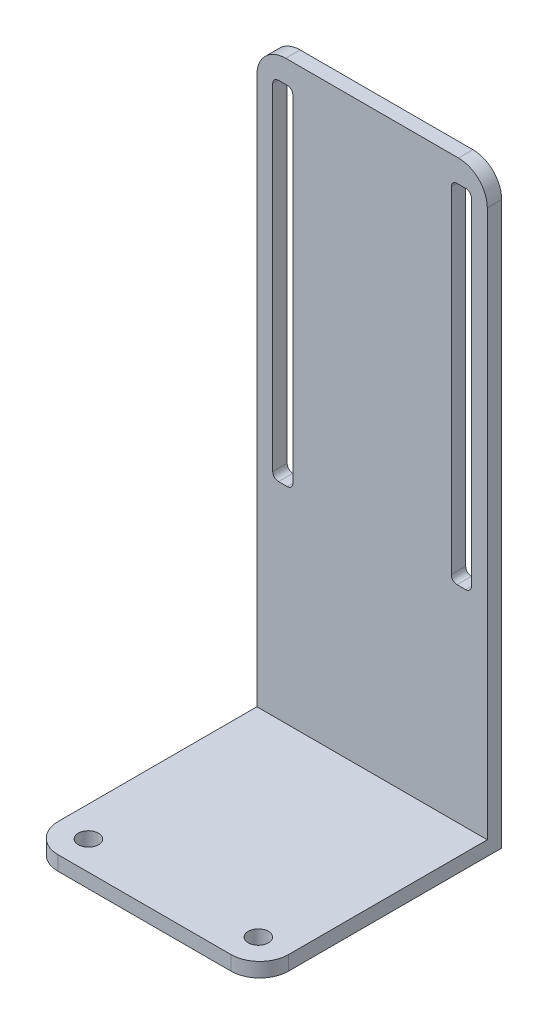
ISO-10303-21;
HEADER;
FILE_DESCRIPTION(('STEP AP214'),'2;1');
FILE_NAME('part.step','',(''),(''),'','','');
FILE_SCHEMA(('AUTOMOTIVE_DESIGN { 1 0 10303 214 1 1 1 1 }'));
ENDSEC;
DATA;
#1=APPLICATION_CONTEXT('core data for automotive mechanical design processes');
#2=APPLICATION_PROTOCOL_DEFINITION('international standard','automotive_design',2000,#1);
#3=PRODUCT_CONTEXT('',#1,'mechanical');
#4=PRODUCT('Part','Part','',(#3));
#5=PRODUCT_RELATED_PRODUCT_CATEGORY('part','',(#4));
#6=PRODUCT_DEFINITION_FORMATION('','',#4);
#7=PRODUCT_DEFINITION_CONTEXT('part definition',#1,'design');
#8=PRODUCT_DEFINITION('design','',#6,#7);
#9=PRODUCT_DEFINITION_SHAPE('','',#8);
#10=(LENGTH_UNIT() NAMED_UNIT(*) SI_UNIT(.MILLI.,.METRE.));
#11=(NAMED_UNIT(*) PLANE_ANGLE_UNIT() SI_UNIT($,.RADIAN.));
#12=(NAMED_UNIT(*) SI_UNIT($,.STERADIAN.) SOLID_ANGLE_UNIT());
#13=UNCERTAINTY_MEASURE_WITH_UNIT(LENGTH_MEASURE(1.E-05),#10,'distance_accuracy_value','');
#14=(GEOMETRIC_REPRESENTATION_CONTEXT(3) GLOBAL_UNCERTAINTY_ASSIGNED_CONTEXT((#13)) GLOBAL_UNIT_ASSIGNED_CONTEXT((#10,
#11,#12)) REPRESENTATION_CONTEXT('',''));
#15=CARTESIAN_POINT('',(0.,0.,0.));
#16=DIRECTION('',(0.,0.,1.));
#17=DIRECTION('',(1.,0.,0.));
#18=AXIS2_PLACEMENT_3D('',#15,#16,#17);
#19=CARTESIAN_POINT('',(-15.,2.5,16.));
#20=DIRECTION('',(0.,-1.,0.));
#21=DIRECTION('',(0.,0.,-1.));
#22=AXIS2_PLACEMENT_3D('',#19,#20,#21);
#23=PLANE('',#22);
#24=CARTESIAN_POINT('',(14.75,2.5,16.));
#25=DIRECTION('',(0.,1.,0.));
#26=DIRECTION('',(0.,0.,1.));
#27=AXIS2_PLACEMENT_3D('',#24,#25,#26);
#28=CIRCLE('',#27,1.75);
#29=CARTESIAN_POINT('',(14.75,2.5,17.75));
#30=VERTEX_POINT('',#29);
#31=EDGE_CURVE('E403',#30,#30,#28,.T.);
#32=ORIENTED_EDGE('',*,*,#31,.F.);
#33=EDGE_LOOP('',(#32));
#34=FACE_BOUND('',#33,.T.);
#35=CARTESIAN_POINT('',(-14.75,2.5,16.));
#36=DIRECTION('',(0.,-1.,0.));
#37=DIRECTION('',(0.,0.,-1.));
#38=AXIS2_PLACEMENT_3D('',#35,#36,#37);
#39=CIRCLE('',#38,1.75000000000001);
#40=CARTESIAN_POINT('',(-14.75,2.5,14.25));
#41=VERTEX_POINT('',#40);
#42=EDGE_CURVE('E409',#41,#41,#39,.T.);
#43=ORIENTED_EDGE('',*,*,#42,.T.);
#44=EDGE_LOOP('',(#43));
#45=FACE_BOUND('',#44,.T.);
#46=DIRECTION('',(1.,0.,0.));
#47=VECTOR('',#46,1.);
#48=CARTESIAN_POINT('',(-20.,2.5,-18.5));
#49=LINE('',#48,#47);
#50=CARTESIAN_POINT('',(-20.,2.5,-18.5));
#51=VERTEX_POINT('',#50);
#52=CARTESIAN_POINT('',(20.,2.5,-18.5));
#53=VERTEX_POINT('',#52);
#54=EDGE_CURVE('E317',#51,#53,#49,.T.);
#55=ORIENTED_EDGE('',*,*,#54,.F.);
#56=DIRECTION('',(0.,0.,1.));
#57=VECTOR('',#56,1.);
#58=CARTESIAN_POINT('',(-20.,2.5,-21.));
#59=LINE('',#58,#57);
#60=CARTESIAN_POINT('',(-20.,2.5,16.));
#61=VERTEX_POINT('',#60);
#62=EDGE_CURVE('E422',#51,#61,#59,.T.);
#63=ORIENTED_EDGE('',*,*,#62,.T.);
#64=CARTESIAN_POINT('',(-15.,2.5,16.));
#65=DIRECTION('',(0.,-1.,0.));
#66=DIRECTION('',(0.,0.,-1.));
#67=AXIS2_PLACEMENT_3D('',#64,#65,#66);
#68=CIRCLE('',#67,5.);
#69=CARTESIAN_POINT('',(-15.,2.5,21.));
#70=VERTEX_POINT('',#69);
#71=EDGE_CURVE('E418',#70,#61,#68,.T.);
#72=ORIENTED_EDGE('',*,*,#71,.F.);
#73=DIRECTION('',(-1.,0.,0.));
#74=VECTOR('',#73,1.);
#75=CARTESIAN_POINT('',(15.,2.5,21.));
#76=LINE('',#75,#74);
#77=CARTESIAN_POINT('',(15.,2.5,21.));
#78=VERTEX_POINT('',#77);
#79=EDGE_CURVE('E415',#78,#70,#76,.T.);
#80=ORIENTED_EDGE('',*,*,#79,.F.);
#81=CARTESIAN_POINT('',(15.,2.5,16.));
#82=DIRECTION('',(0.,-1.,0.));
#83=DIRECTION('',(0.,0.,-1.));
#84=AXIS2_PLACEMENT_3D('',#81,#82,#83);
#85=CIRCLE('',#84,5.);
#86=CARTESIAN_POINT('',(20.,2.5,16.));
#87=VERTEX_POINT('',#86);
#88=EDGE_CURVE('E426',#87,#78,#85,.T.);
#89=ORIENTED_EDGE('',*,*,#88,.F.);
#90=DIRECTION('',(0.,0.,1.));
#91=VECTOR('',#90,1.);
#92=CARTESIAN_POINT('',(20.,2.5,-21.));
#93=LINE('',#92,#91);
#94=EDGE_CURVE('E424',#53,#87,#93,.T.);
#95=ORIENTED_EDGE('',*,*,#94,.F.);
#96=EDGE_LOOP('',(#55,#63,#72,#80,#89,#95));
#97=FACE_BOUND('',#96,.T.);
#98=ADVANCED_FACE('F83',(#34,#45,#97),#23,.F.);
#99=CARTESIAN_POINT('',(-15.,0.,16.));
#100=DIRECTION('',(0.,-1.,0.));
#101=DIRECTION('',(0.,0.,-1.));
#102=AXIS2_PLACEMENT_3D('',#99,#100,#101);
#103=PLANE('',#102);
#104=DIRECTION('',(-1.,0.,0.));
#105=VECTOR('',#104,1.);
#106=CARTESIAN_POINT('',(15.,0.,21.));
#107=LINE('',#106,#105);
#108=CARTESIAN_POINT('',(15.,0.,21.));
#109=VERTEX_POINT('',#108);
#110=CARTESIAN_POINT('',(-15.,0.,21.));
#111=VERTEX_POINT('',#110);
#112=EDGE_CURVE('E412',#109,#111,#107,.T.);
#113=ORIENTED_EDGE('',*,*,#112,.T.);
#114=CARTESIAN_POINT('',(-15.,0.,16.));
#115=DIRECTION('',(0.,-1.,0.));
#116=DIRECTION('',(0.,0.,-1.));
#117=AXIS2_PLACEMENT_3D('',#114,#115,#116);
#118=CIRCLE('',#117,5.);
#119=CARTESIAN_POINT('',(-20.,0.,16.));
#120=VERTEX_POINT('',#119);
#121=EDGE_CURVE('E432',#111,#120,#118,.T.);
#122=ORIENTED_EDGE('',*,*,#121,.T.);
#123=DIRECTION('',(0.,0.,1.));
#124=VECTOR('',#123,1.);
#125=CARTESIAN_POINT('',(-20.,0.,-21.));
#126=LINE('',#125,#124);
#127=CARTESIAN_POINT('',(-20.,0.,-21.));
#128=VERTEX_POINT('',#127);
#129=EDGE_CURVE('E435',#128,#120,#126,.T.);
#130=ORIENTED_EDGE('',*,*,#129,.F.);
#131=DIRECTION('',(-1.,0.,0.));
#132=VECTOR('',#131,1.);
#133=CARTESIAN_POINT('',(20.,0.,-21.));
#134=LINE('',#133,#132);
#135=CARTESIAN_POINT('',(20.,0.,-21.));
#136=VERTEX_POINT('',#135);
#137=EDGE_CURVE('E438',#136,#128,#134,.T.);
#138=ORIENTED_EDGE('',*,*,#137,.F.);
#139=DIRECTION('',(0.,0.,1.));
#140=VECTOR('',#139,1.);
#141=CARTESIAN_POINT('',(20.,0.,-21.));
#142=LINE('',#141,#140);
#143=CARTESIAN_POINT('',(20.,0.,16.));
#144=VERTEX_POINT('',#143);
#145=EDGE_CURVE('E441',#136,#144,#142,.T.);
#146=ORIENTED_EDGE('',*,*,#145,.T.);
#147=CARTESIAN_POINT('',(15.,0.,16.));
#148=DIRECTION('',(0.,-1.,0.));
#149=DIRECTION('',(0.,0.,-1.));
#150=AXIS2_PLACEMENT_3D('',#147,#148,#149);
#151=CIRCLE('',#150,5.);
#152=EDGE_CURVE('E419',#144,#109,#151,.T.);
#153=ORIENTED_EDGE('',*,*,#152,.T.);
#154=EDGE_LOOP('',(#113,#122,#130,#138,#146,#153));
#155=FACE_BOUND('',#154,.T.);
#156=CARTESIAN_POINT('',(-14.75,0.,16.));
#157=DIRECTION('',(0.,-1.,0.));
#158=DIRECTION('',(0.,0.,-1.));
#159=AXIS2_PLACEMENT_3D('',#156,#157,#158);
#160=CIRCLE('',#159,1.75000000000001);
#161=CARTESIAN_POINT('',(-14.75,0.,14.25));
#162=VERTEX_POINT('',#161);
#163=EDGE_CURVE('E406',#162,#162,#160,.T.);
#164=ORIENTED_EDGE('',*,*,#163,.F.);
#165=EDGE_LOOP('',(#164));
#166=FACE_BOUND('',#165,.T.);
#167=CARTESIAN_POINT('',(14.75,0.,16.));
#168=DIRECTION('',(0.,1.,0.));
#169=DIRECTION('',(0.,0.,1.));
#170=AXIS2_PLACEMENT_3D('',#167,#168,#169);
#171=CIRCLE('',#170,1.75);
#172=CARTESIAN_POINT('',(14.75,0.,17.75));
#173=VERTEX_POINT('',#172);
#174=EDGE_CURVE('E402',#173,#173,#171,.T.);
#175=ORIENTED_EDGE('',*,*,#174,.T.);
#176=EDGE_LOOP('',(#175));
#177=FACE_BOUND('',#176,.T.);
#178=ADVANCED_FACE('F492',(#155,#166,#177),#103,.T.);
#179=CARTESIAN_POINT('',(15.,2.5,21.));
#180=DIRECTION('',(0.,0.,1.));
#181=DIRECTION('',(1.,0.,0.));
#182=AXIS2_PLACEMENT_3D('',#179,#180,#181);
#183=PLANE('',#182);
#184=ORIENTED_EDGE('',*,*,#112,.F.);
#185=DIRECTION('',(0.,-1.,0.));
#186=VECTOR('',#185,1.);
#187=CARTESIAN_POINT('',(15.,2.5,21.));
#188=LINE('',#187,#186);
#189=EDGE_CURVE('E446',#78,#109,#188,.T.);
#190=ORIENTED_EDGE('',*,*,#189,.F.);
#191=ORIENTED_EDGE('',*,*,#79,.T.);
#192=DIRECTION('',(0.,-1.,0.));
#193=VECTOR('',#192,1.);
#194=CARTESIAN_POINT('',(-15.,2.5,21.));
#195=LINE('',#194,#193);
#196=EDGE_CURVE('E429',#70,#111,#195,.T.);
#197=ORIENTED_EDGE('',*,*,#196,.T.);
#198=EDGE_LOOP('',(#184,#190,#191,#197));
#199=FACE_BOUND('',#198,.T.);
#200=ADVANCED_FACE('F501',(#199),#183,.T.);
#201=CARTESIAN_POINT('',(15.,2.5,16.));
#202=DIRECTION('',(0.,-1.,0.));
#203=DIRECTION('',(0.,0.,-1.));
#204=AXIS2_PLACEMENT_3D('',#201,#202,#203);
#205=CYLINDRICAL_SURFACE('',#204,5.);
#206=ORIENTED_EDGE('',*,*,#152,.F.);
#207=DIRECTION('',(0.,-1.,0.));
#208=VECTOR('',#207,1.);
#209=CARTESIAN_POINT('',(20.,2.5,16.));
#210=LINE('',#209,#208);
#211=EDGE_CURVE('E449',#87,#144,#210,.T.);
#212=ORIENTED_EDGE('',*,*,#211,.F.);
#213=ORIENTED_EDGE('',*,*,#88,.T.);
#214=ORIENTED_EDGE('',*,*,#189,.T.);
#215=EDGE_LOOP('',(#206,#212,#213,#214));
#216=FACE_BOUND('',#215,.T.);
#217=ADVANCED_FACE('F496',(#216),#205,.T.);
#218=CARTESIAN_POINT('',(20.,2.5,-21.));
#219=DIRECTION('',(1.,0.,0.));
#220=DIRECTION('',(0.,0.,-1.));
#221=AXIS2_PLACEMENT_3D('',#218,#219,#220);
#222=PLANE('',#221);
#223=DIRECTION('',(0.,-1.,0.));
#224=VECTOR('',#223,1.);
#225=CARTESIAN_POINT('',(20.,2.5,-21.));
#226=LINE('',#225,#224);
#227=CARTESIAN_POINT('',(20.,97.5,-21.));
#228=VERTEX_POINT('',#227);
#229=EDGE_CURVE('E451',#228,#136,#226,.T.);
#230=ORIENTED_EDGE('',*,*,#229,.F.);
#231=DIRECTION('',(0.,0.,-1.));
#232=VECTOR('',#231,1.);
#233=CARTESIAN_POINT('',(20.,97.5,-21.));
#234=LINE('',#233,#232);
#235=CARTESIAN_POINT('',(20.,97.5,-18.5));
#236=VERTEX_POINT('',#235);
#237=EDGE_CURVE('E467',#228,#236,#234,.F.);
#238=ORIENTED_EDGE('',*,*,#237,.T.);
#239=DIRECTION('',(0.,-1.,0.));
#240=VECTOR('',#239,1.);
#241=CARTESIAN_POINT('',(20.,102.5,-18.5));
#242=LINE('',#241,#240);
#243=EDGE_CURVE('E396',#236,#53,#242,.T.);
#244=ORIENTED_EDGE('',*,*,#243,.T.);
#245=ORIENTED_EDGE('',*,*,#94,.T.);
#246=ORIENTED_EDGE('',*,*,#211,.T.);
#247=ORIENTED_EDGE('',*,*,#145,.F.);
#248=EDGE_LOOP('',(#230,#238,#244,#245,#246,#247));
#249=FACE_BOUND('',#248,.T.);
#250=ADVANCED_FACE('F488',(#249),#222,.T.);
#251=CARTESIAN_POINT('',(20.,2.5,-21.));
#252=DIRECTION('',(0.,0.,1.));
#253=DIRECTION('',(1.,0.,0.));
#254=AXIS2_PLACEMENT_3D('',#251,#252,#253);
#255=PLANE('',#254);
#256=DIRECTION('',(1.,0.,0.));
#257=VECTOR('',#256,1.);
#258=CARTESIAN_POINT('',(14.75,38.235172541365,-21.));
#259=LINE('',#258,#257);
#260=CARTESIAN_POINT('',(14.75,38.235172541365,-21.));
#261=VERTEX_POINT('',#260);
#262=CARTESIAN_POINT('',(16.25,38.235172541365,-21.));
#263=VERTEX_POINT('',#262);
#264=EDGE_CURVE('E267',#261,#263,#259,.T.);
#265=ORIENTED_EDGE('',*,*,#264,.T.);
#266=CARTESIAN_POINT('',(16.25,39.235172541365,-21.));
#267=DIRECTION('',(0.,0.,1.));
#268=DIRECTION('',(-1.,0.,0.));
#269=AXIS2_PLACEMENT_3D('',#266,#267,#268);
#270=CIRCLE('',#269,1.);
#271=CARTESIAN_POINT('',(17.25,39.235172541365,-21.));
#272=VERTEX_POINT('',#271);
#273=EDGE_CURVE('E259',#263,#272,#270,.T.);
#274=ORIENTED_EDGE('',*,*,#273,.T.);
#275=DIRECTION('',(0.,1.,0.));
#276=VECTOR('',#275,1.);
#277=CARTESIAN_POINT('',(17.25,92.6329456028855,-21.));
#278=LINE('',#277,#276);
#279=CARTESIAN_POINT('',(17.25,97.5563576507307,-21.));
#280=VERTEX_POINT('',#279);
#281=EDGE_CURVE('E270',#272,#280,#278,.T.);
#282=ORIENTED_EDGE('',*,*,#281,.T.);
#283=CARTESIAN_POINT('',(16.25,97.5563576507307,-21.));
#284=DIRECTION('',(0.,0.,1.));
#285=DIRECTION('',(1.,0.,0.));
#286=AXIS2_PLACEMENT_3D('',#283,#284,#285);
#287=CIRCLE('',#286,1.);
#288=CARTESIAN_POINT('',(16.25,98.5563576507307,-21.));
#289=VERTEX_POINT('',#288);
#290=EDGE_CURVE('E98',#280,#289,#287,.T.);
#291=ORIENTED_EDGE('',*,*,#290,.T.);
#292=DIRECTION('',(-1.,0.,0.));
#293=VECTOR('',#292,1.);
#294=CARTESIAN_POINT('',(16.25,98.5563576507307,-21.));
#295=LINE('',#294,#293);
#296=CARTESIAN_POINT('',(14.75,98.5563576507307,-21.));
#297=VERTEX_POINT('',#296);
#298=EDGE_CURVE('E285',#289,#297,#295,.T.);
#299=ORIENTED_EDGE('',*,*,#298,.T.);
#300=CARTESIAN_POINT('',(14.75,97.5563576507307,-21.));
#301=DIRECTION('',(0.,0.,1.));
#302=DIRECTION('',(1.,0.,0.));
#303=AXIS2_PLACEMENT_3D('',#300,#301,#302);
#304=CIRCLE('',#303,1.);
#305=CARTESIAN_POINT('',(13.75,97.5563576507307,-21.));
#306=VERTEX_POINT('',#305);
#307=EDGE_CURVE('E288',#297,#306,#304,.T.);
#308=ORIENTED_EDGE('',*,*,#307,.T.);
#309=DIRECTION('',(0.,-1.,0.));
#310=VECTOR('',#309,1.);
#311=CARTESIAN_POINT('',(13.75,97.5563576507307,-21.));
#312=LINE('',#311,#310);
#313=CARTESIAN_POINT('',(13.75,39.235172541365,-21.));
#314=VERTEX_POINT('',#313);
#315=EDGE_CURVE('E291',#306,#314,#312,.T.);
#316=ORIENTED_EDGE('',*,*,#315,.T.);
#317=CARTESIAN_POINT('',(14.75,39.235172541365,-21.));
#318=DIRECTION('',(0.,0.,1.));
#319=DIRECTION('',(1.,0.,0.));
#320=AXIS2_PLACEMENT_3D('',#317,#318,#319);
#321=CIRCLE('',#320,1.);
#322=EDGE_CURVE('E294',#314,#261,#321,.T.);
#323=ORIENTED_EDGE('',*,*,#322,.T.);
#324=EDGE_LOOP('',(#265,#274,#282,#291,#299,#308,#316,#323));
#325=FACE_BOUND('',#324,.T.);
#326=CARTESIAN_POINT('',(-16.25,97.5563576507307,-21.));
#327=DIRECTION('',(0.,0.,1.));
#328=DIRECTION('',(-1.,0.,0.));
#329=AXIS2_PLACEMENT_3D('',#326,#327,#328);
#330=CIRCLE('',#329,1.);
#331=CARTESIAN_POINT('',(-16.25,98.5563576507307,-21.));
#332=VERTEX_POINT('',#331);
#333=CARTESIAN_POINT('',(-17.25,97.5563576507307,-21.));
#334=VERTEX_POINT('',#333);
#335=EDGE_CURVE('E331',#332,#334,#330,.T.);
#336=ORIENTED_EDGE('',*,*,#335,.T.);
#337=DIRECTION('',(0.,-1.,0.));
#338=VECTOR('',#337,1.);
#339=CARTESIAN_POINT('',(-17.25,92.6329456028855,-21.));
#340=LINE('',#339,#338);
#341=CARTESIAN_POINT('',(-17.25,39.235172541365,-21.));
#342=VERTEX_POINT('',#341);
#343=EDGE_CURVE('E350',#334,#342,#340,.T.);
#344=ORIENTED_EDGE('',*,*,#343,.T.);
#345=CARTESIAN_POINT('',(-16.25,39.235172541365,-21.));
#346=DIRECTION('',(0.,0.,1.));
#347=DIRECTION('',(1.,0.,0.));
#348=AXIS2_PLACEMENT_3D('',#345,#346,#347);
#349=CIRCLE('',#348,1.);
#350=CARTESIAN_POINT('',(-16.25,38.235172541365,-21.));
#351=VERTEX_POINT('',#350);
#352=EDGE_CURVE('E385',#342,#351,#349,.T.);
#353=ORIENTED_EDGE('',*,*,#352,.T.);
#354=DIRECTION('',(1.,0.,0.));
#355=VECTOR('',#354,1.);
#356=CARTESIAN_POINT('',(-14.75,38.235172541365,-21.));
#357=LINE('',#356,#355);
#358=CARTESIAN_POINT('',(-14.75,38.235172541365,-21.));
#359=VERTEX_POINT('',#358);
#360=EDGE_CURVE('E106',#351,#359,#357,.T.);
#361=ORIENTED_EDGE('',*,*,#360,.T.);
#362=CARTESIAN_POINT('',(-14.75,39.235172541365,-21.));
#363=DIRECTION('',(0.,0.,1.));
#364=DIRECTION('',(-1.,0.,0.));
#365=AXIS2_PLACEMENT_3D('',#362,#363,#364);
#366=CIRCLE('',#365,1.);
#367=CARTESIAN_POINT('',(-13.75,39.235172541365,-21.));
#368=VERTEX_POINT('',#367);
#369=EDGE_CURVE('E381',#359,#368,#366,.T.);
#370=ORIENTED_EDGE('',*,*,#369,.T.);
#371=DIRECTION('',(0.,1.,0.));
#372=VECTOR('',#371,1.);
#373=CARTESIAN_POINT('',(-13.75,97.5563576507307,-21.));
#374=LINE('',#373,#372);
#375=CARTESIAN_POINT('',(-13.75,97.5563576507307,-21.));
#376=VERTEX_POINT('',#375);
#377=EDGE_CURVE('E378',#368,#376,#374,.T.);
#378=ORIENTED_EDGE('',*,*,#377,.T.);
#379=CARTESIAN_POINT('',(-14.75,97.5563576507307,-21.));
#380=DIRECTION('',(0.,0.,1.));
#381=DIRECTION('',(-1.,0.,0.));
#382=AXIS2_PLACEMENT_3D('',#379,#380,#381);
#383=CIRCLE('',#382,1.);
#384=CARTESIAN_POINT('',(-14.75,98.5563576507307,-21.));
#385=VERTEX_POINT('',#384);
#386=EDGE_CURVE('E375',#376,#385,#383,.T.);
#387=ORIENTED_EDGE('',*,*,#386,.T.);
#388=DIRECTION('',(-1.,0.,0.));
#389=VECTOR('',#388,1.);
#390=CARTESIAN_POINT('',(-16.25,98.5563576507307,-21.));
#391=LINE('',#390,#389);
#392=EDGE_CURVE('E372',#385,#332,#391,.T.);
#393=ORIENTED_EDGE('',*,*,#392,.T.);
#394=EDGE_LOOP('',(#336,#344,#353,#361,#370,#378,#387,#393));
#395=FACE_BOUND('',#394,.T.);
#396=DIRECTION('',(-1.,0.,0.));
#397=VECTOR('',#396,1.);
#398=CARTESIAN_POINT('',(20.,102.5,-21.));
#399=LINE('',#398,#397);
#400=CARTESIAN_POINT('',(15.,102.5,-21.));
#401=VERTEX_POINT('',#400);
#402=CARTESIAN_POINT('',(-15.,102.5,-21.));
#403=VERTEX_POINT('',#402);
#404=EDGE_CURVE('E390',#401,#403,#399,.T.);
#405=ORIENTED_EDGE('',*,*,#404,.F.);
#406=CARTESIAN_POINT('',(15.,97.5,-21.));
#407=DIRECTION('',(0.,0.,1.));
#408=DIRECTION('',(1.,0.,0.));
#409=AXIS2_PLACEMENT_3D('',#406,#407,#408);
#410=CIRCLE('',#409,5.);
#411=EDGE_CURVE('E465',#401,#228,#410,.F.);
#412=ORIENTED_EDGE('',*,*,#411,.T.);
#413=ORIENTED_EDGE('',*,*,#229,.T.);
#414=ORIENTED_EDGE('',*,*,#137,.T.);
#415=DIRECTION('',(0.,-1.,0.));
#416=VECTOR('',#415,1.);
#417=CARTESIAN_POINT('',(-20.,2.5,-21.));
#418=LINE('',#417,#416);
#419=CARTESIAN_POINT('',(-20.,97.5,-21.));
#420=VERTEX_POINT('',#419);
#421=EDGE_CURVE('E453',#420,#128,#418,.T.);
#422=ORIENTED_EDGE('',*,*,#421,.F.);
#423=CARTESIAN_POINT('',(-15.,97.5,-21.));
#424=DIRECTION('',(0.,0.,1.));
#425=DIRECTION('',(1.,0.,0.));
#426=AXIS2_PLACEMENT_3D('',#423,#424,#425);
#427=CIRCLE('',#426,5.);
#428=EDGE_CURVE('E463',#420,#403,#427,.F.);
#429=ORIENTED_EDGE('',*,*,#428,.T.);
#430=EDGE_LOOP('',(#405,#412,#413,#414,#422,#429));
#431=FACE_BOUND('',#430,.T.);
#432=ADVANCED_FACE('F274',(#325,#395,#431),#255,.F.);
#433=CARTESIAN_POINT('',(-20.,2.5,-21.));
#434=DIRECTION('',(1.,0.,0.));
#435=DIRECTION('',(0.,0.,-1.));
#436=AXIS2_PLACEMENT_3D('',#433,#434,#435);
#437=PLANE('',#436);
#438=DIRECTION('',(0.,-1.,0.));
#439=VECTOR('',#438,1.);
#440=CARTESIAN_POINT('',(-20.,102.5,-18.5));
#441=LINE('',#440,#439);
#442=CARTESIAN_POINT('',(-20.,97.5,-18.5));
#443=VERTEX_POINT('',#442);
#444=EDGE_CURVE('E400',#443,#51,#441,.T.);
#445=ORIENTED_EDGE('',*,*,#444,.F.);
#446=DIRECTION('',(0.,0.,1.));
#447=VECTOR('',#446,1.);
#448=CARTESIAN_POINT('',(-20.,97.5,-21.));
#449=LINE('',#448,#447);
#450=EDGE_CURVE('E12',#443,#420,#449,.F.);
#451=ORIENTED_EDGE('',*,*,#450,.T.);
#452=ORIENTED_EDGE('',*,*,#421,.T.);
#453=ORIENTED_EDGE('',*,*,#129,.T.);
#454=DIRECTION('',(0.,-1.,0.));
#455=VECTOR('',#454,1.);
#456=CARTESIAN_POINT('',(-20.,2.5,16.));
#457=LINE('',#456,#455);
#458=EDGE_CURVE('E455',#61,#120,#457,.T.);
#459=ORIENTED_EDGE('',*,*,#458,.F.);
#460=ORIENTED_EDGE('',*,*,#62,.F.);
#461=EDGE_LOOP('',(#445,#451,#452,#453,#459,#460));
#462=FACE_BOUND('',#461,.T.);
#463=ADVANCED_FACE('F510',(#462),#437,.F.);
#464=CARTESIAN_POINT('',(-15.,2.5,16.));
#465=DIRECTION('',(0.,-1.,0.));
#466=DIRECTION('',(0.,0.,-1.));
#467=AXIS2_PLACEMENT_3D('',#464,#465,#466);
#468=CYLINDRICAL_SURFACE('',#467,5.);
#469=ORIENTED_EDGE('',*,*,#121,.F.);
#470=ORIENTED_EDGE('',*,*,#196,.F.);
#471=ORIENTED_EDGE('',*,*,#71,.T.);
#472=ORIENTED_EDGE('',*,*,#458,.T.);
#473=EDGE_LOOP('',(#469,#470,#471,#472));
#474=FACE_BOUND('',#473,.T.);
#475=ADVANCED_FACE('F504',(#474),#468,.T.);
#476=CARTESIAN_POINT('',(-14.75,2.5,16.));
#477=DIRECTION('',(0.,-1.,0.));
#478=DIRECTION('',(0.,0.,-1.));
#479=AXIS2_PLACEMENT_3D('',#476,#477,#478);
#480=CYLINDRICAL_SURFACE('',#479,1.75000000000001);
#481=ORIENTED_EDGE('',*,*,#42,.F.);
#482=EDGE_LOOP('',(#481));
#483=FACE_BOUND('',#482,.T.);
#484=ORIENTED_EDGE('',*,*,#163,.T.);
#485=EDGE_LOOP('',(#484));
#486=FACE_BOUND('',#485,.T.);
#487=ADVANCED_FACE('F530',(#483,#486),#480,.F.);
#488=CARTESIAN_POINT('',(14.75,2.5,16.));
#489=DIRECTION('',(0.,-1.,0.));
#490=DIRECTION('',(0.,0.,-1.));
#491=AXIS2_PLACEMENT_3D('',#488,#489,#490);
#492=CYLINDRICAL_SURFACE('',#491,1.75);
#493=ORIENTED_EDGE('',*,*,#31,.T.);
#494=EDGE_LOOP('',(#493));
#495=FACE_BOUND('',#494,.T.);
#496=ORIENTED_EDGE('',*,*,#174,.F.);
#497=EDGE_LOOP('',(#496));
#498=FACE_BOUND('',#497,.T.);
#499=ADVANCED_FACE('F553',(#495,#498),#492,.F.);
#500=CARTESIAN_POINT('',(-20.,102.5,-18.5));
#501=DIRECTION('',(0.,0.,-1.));
#502=DIRECTION('',(-1.,0.,0.));
#503=AXIS2_PLACEMENT_3D('',#500,#501,#502);
#504=PLANE('',#503);
#505=DIRECTION('',(0.,1.,0.));
#506=VECTOR('',#505,1.);
#507=CARTESIAN_POINT('',(17.25,92.6329456028855,-18.5));
#508=LINE('',#507,#506);
#509=CARTESIAN_POINT('',(17.25,39.235172541365,-18.5));
#510=VERTEX_POINT('',#509);
#511=CARTESIAN_POINT('',(17.25,97.5563576507307,-18.5));
#512=VERTEX_POINT('',#511);
#513=EDGE_CURVE('E298',#510,#512,#508,.T.);
#514=ORIENTED_EDGE('',*,*,#513,.F.);
#515=CARTESIAN_POINT('',(16.25,39.235172541365,-18.5));
#516=DIRECTION('',(0.,0.,1.));
#517=DIRECTION('',(-1.,0.,0.));
#518=AXIS2_PLACEMENT_3D('',#515,#516,#517);
#519=CIRCLE('',#518,1.);
#520=CARTESIAN_POINT('',(16.25,38.235172541365,-18.5));
#521=VERTEX_POINT('',#520);
#522=EDGE_CURVE('E262',#521,#510,#519,.T.);
#523=ORIENTED_EDGE('',*,*,#522,.F.);
#524=DIRECTION('',(1.,0.,0.));
#525=VECTOR('',#524,1.);
#526=CARTESIAN_POINT('',(14.75,38.235172541365,-18.5));
#527=LINE('',#526,#525);
#528=CARTESIAN_POINT('',(14.75,38.235172541365,-18.5));
#529=VERTEX_POINT('',#528);
#530=EDGE_CURVE('E278',#529,#521,#527,.T.);
#531=ORIENTED_EDGE('',*,*,#530,.F.);
#532=CARTESIAN_POINT('',(14.75,39.235172541365,-18.5));
#533=DIRECTION('',(0.,0.,1.));
#534=DIRECTION('',(1.,0.,0.));
#535=AXIS2_PLACEMENT_3D('',#532,#533,#534);
#536=CIRCLE('',#535,1.);
#537=CARTESIAN_POINT('',(13.75,39.235172541365,-18.5));
#538=VERTEX_POINT('',#537);
#539=EDGE_CURVE('E281',#538,#529,#536,.T.);
#540=ORIENTED_EDGE('',*,*,#539,.F.);
#541=DIRECTION('',(0.,-1.,0.));
#542=VECTOR('',#541,1.);
#543=CARTESIAN_POINT('',(13.75,97.5563576507307,-18.5));
#544=LINE('',#543,#542);
#545=CARTESIAN_POINT('',(13.75,97.5563576507307,-18.5));
#546=VERTEX_POINT('',#545);
#547=EDGE_CURVE('E310',#546,#538,#544,.T.);
#548=ORIENTED_EDGE('',*,*,#547,.F.);
#549=CARTESIAN_POINT('',(14.75,97.5563576507307,-18.5));
#550=DIRECTION('',(0.,0.,1.));
#551=DIRECTION('',(1.,0.,0.));
#552=AXIS2_PLACEMENT_3D('',#549,#550,#551);
#553=CIRCLE('',#552,1.);
#554=CARTESIAN_POINT('',(14.75,98.5563576507307,-18.5));
#555=VERTEX_POINT('',#554);
#556=EDGE_CURVE('E307',#555,#546,#553,.T.);
#557=ORIENTED_EDGE('',*,*,#556,.F.);
#558=DIRECTION('',(-1.,0.,0.));
#559=VECTOR('',#558,1.);
#560=CARTESIAN_POINT('',(16.25,98.5563576507307,-18.5));
#561=LINE('',#560,#559);
#562=CARTESIAN_POINT('',(16.25,98.5563576507307,-18.5));
#563=VERTEX_POINT('',#562);
#564=EDGE_CURVE('E304',#563,#555,#561,.T.);
#565=ORIENTED_EDGE('',*,*,#564,.F.);
#566=CARTESIAN_POINT('',(16.25,97.5563576507307,-18.5));
#567=DIRECTION('',(0.,0.,1.));
#568=DIRECTION('',(1.,0.,0.));
#569=AXIS2_PLACEMENT_3D('',#566,#567,#568);
#570=CIRCLE('',#569,1.);
#571=EDGE_CURVE('E301',#512,#563,#570,.T.);
#572=ORIENTED_EDGE('',*,*,#571,.F.);
#573=EDGE_LOOP('',(#514,#523,#531,#540,#548,#557,#565,#572));
#574=FACE_BOUND('',#573,.T.);
#575=CARTESIAN_POINT('',(-16.25,39.235172541365,-18.5));
#576=DIRECTION('',(0.,0.,1.));
#577=DIRECTION('',(1.,0.,0.));
#578=AXIS2_PLACEMENT_3D('',#575,#576,#577);
#579=CIRCLE('',#578,1.);
#580=CARTESIAN_POINT('',(-17.25,39.235172541365,-18.5));
#581=VERTEX_POINT('',#580);
#582=CARTESIAN_POINT('',(-16.25,38.235172541365,-18.5));
#583=VERTEX_POINT('',#582);
#584=EDGE_CURVE('E299',#581,#583,#579,.T.);
#585=ORIENTED_EDGE('',*,*,#584,.F.);
#586=DIRECTION('',(0.,-1.,0.));
#587=VECTOR('',#586,1.);
#588=CARTESIAN_POINT('',(-17.25,92.6329456028855,-18.5));
#589=LINE('',#588,#587);
#590=CARTESIAN_POINT('',(-17.25,97.5563576507307,-18.5));
#591=VERTEX_POINT('',#590);
#592=EDGE_CURVE('E346',#591,#581,#589,.T.);
#593=ORIENTED_EDGE('',*,*,#592,.F.);
#594=CARTESIAN_POINT('',(-16.25,97.5563576507307,-18.5));
#595=DIRECTION('',(0.,0.,1.));
#596=DIRECTION('',(-1.,0.,0.));
#597=AXIS2_PLACEMENT_3D('',#594,#595,#596);
#598=CIRCLE('',#597,1.);
#599=CARTESIAN_POINT('',(-16.25,98.5563576507307,-18.5));
#600=VERTEX_POINT('',#599);
#601=EDGE_CURVE('E349',#600,#591,#598,.T.);
#602=ORIENTED_EDGE('',*,*,#601,.F.);
#603=DIRECTION('',(-1.,0.,0.));
#604=VECTOR('',#603,1.);
#605=CARTESIAN_POINT('',(-16.25,98.5563576507307,-18.5));
#606=LINE('',#605,#604);
#607=CARTESIAN_POINT('',(-14.75,98.5563576507307,-18.5));
#608=VERTEX_POINT('',#607);
#609=EDGE_CURVE('E353',#608,#600,#606,.T.);
#610=ORIENTED_EDGE('',*,*,#609,.F.);
#611=CARTESIAN_POINT('',(-14.75,97.5563576507307,-18.5));
#612=DIRECTION('',(0.,0.,1.));
#613=DIRECTION('',(-1.,0.,0.));
#614=AXIS2_PLACEMENT_3D('',#611,#612,#613);
#615=CIRCLE('',#614,1.);
#616=CARTESIAN_POINT('',(-13.75,97.5563576507307,-18.5));
#617=VERTEX_POINT('',#616);
#618=EDGE_CURVE('E356',#617,#608,#615,.T.);
#619=ORIENTED_EDGE('',*,*,#618,.F.);
#620=DIRECTION('',(0.,1.,0.));
#621=VECTOR('',#620,1.);
#622=CARTESIAN_POINT('',(-13.75,97.5563576507307,-18.5));
#623=LINE('',#622,#621);
#624=CARTESIAN_POINT('',(-13.75,39.235172541365,-18.5));
#625=VERTEX_POINT('',#624);
#626=EDGE_CURVE('E359',#625,#617,#623,.T.);
#627=ORIENTED_EDGE('',*,*,#626,.F.);
#628=CARTESIAN_POINT('',(-14.75,39.235172541365,-18.5));
#629=DIRECTION('',(0.,0.,1.));
#630=DIRECTION('',(-1.,0.,0.));
#631=AXIS2_PLACEMENT_3D('',#628,#629,#630);
#632=CIRCLE('',#631,1.);
#633=CARTESIAN_POINT('',(-14.75,38.235172541365,-18.5));
#634=VERTEX_POINT('',#633);
#635=EDGE_CURVE('E362',#634,#625,#632,.T.);
#636=ORIENTED_EDGE('',*,*,#635,.F.);
#637=DIRECTION('',(1.,0.,0.));
#638=VECTOR('',#637,1.);
#639=CARTESIAN_POINT('',(-14.75,38.235172541365,-18.5));
#640=LINE('',#639,#638);
#641=EDGE_CURVE('E365',#583,#634,#640,.T.);
#642=ORIENTED_EDGE('',*,*,#641,.F.);
#643=EDGE_LOOP('',(#585,#593,#602,#610,#619,#627,#636,#642));
#644=FACE_BOUND('',#643,.T.);
#645=ORIENTED_EDGE('',*,*,#243,.F.);
#646=CARTESIAN_POINT('',(15.,97.5,-18.5));
#647=DIRECTION('',(0.,0.,-1.));
#648=DIRECTION('',(-1.,0.,0.));
#649=AXIS2_PLACEMENT_3D('',#646,#647,#648);
#650=CIRCLE('',#649,5.);
#651=CARTESIAN_POINT('',(15.,102.5,-18.5));
#652=VERTEX_POINT('',#651);
#653=EDGE_CURVE('E91',#236,#652,#650,.F.);
#654=ORIENTED_EDGE('',*,*,#653,.T.);
#655=DIRECTION('',(1.,0.,0.));
#656=VECTOR('',#655,1.);
#657=CARTESIAN_POINT('',(-20.,102.5,-18.5));
#658=LINE('',#657,#656);
#659=CARTESIAN_POINT('',(-15.,102.5,-18.5));
#660=VERTEX_POINT('',#659);
#661=EDGE_CURVE('E393',#660,#652,#658,.T.);
#662=ORIENTED_EDGE('',*,*,#661,.F.);
#663=CARTESIAN_POINT('',(-15.,97.5,-18.5));
#664=DIRECTION('',(0.,0.,-1.));
#665=DIRECTION('',(-1.,0.,0.));
#666=AXIS2_PLACEMENT_3D('',#663,#664,#665);
#667=CIRCLE('',#666,5.);
#668=EDGE_CURVE('E469',#660,#443,#667,.F.);
#669=ORIENTED_EDGE('',*,*,#668,.T.);
#670=ORIENTED_EDGE('',*,*,#444,.T.);
#671=ORIENTED_EDGE('',*,*,#54,.T.);
#672=EDGE_LOOP('',(#645,#654,#662,#669,#670,#671));
#673=FACE_BOUND('',#672,.T.);
#674=ADVANCED_FACE('F474',(#574,#644,#673),#504,.F.);
#675=CARTESIAN_POINT('',(0.,102.5,0.));
#676=DIRECTION('',(0.,1.,0.));
#677=DIRECTION('',(0.,0.,1.));
#678=AXIS2_PLACEMENT_3D('',#675,#676,#677);
#679=PLANE('',#678);
#680=ORIENTED_EDGE('',*,*,#661,.T.);
#681=DIRECTION('',(0.,0.,-1.));
#682=VECTOR('',#681,1.);
#683=CARTESIAN_POINT('',(15.,102.5,0.));
#684=LINE('',#683,#682);
#685=EDGE_CURVE('E460',#652,#401,#684,.T.);
#686=ORIENTED_EDGE('',*,*,#685,.T.);
#687=ORIENTED_EDGE('',*,*,#404,.T.);
#688=DIRECTION('',(0.,0.,1.));
#689=VECTOR('',#688,1.);
#690=CARTESIAN_POINT('',(-15.,102.5,-18.5));
#691=LINE('',#690,#689);
#692=EDGE_CURVE('E448',#403,#660,#691,.T.);
#693=ORIENTED_EDGE('',*,*,#692,.T.);
#694=EDGE_LOOP('',(#680,#686,#687,#693));
#695=FACE_BOUND('',#694,.T.);
#696=ADVANCED_FACE('F479',(#695),#679,.T.);
#697=CARTESIAN_POINT('',(15.,97.5,0.));
#698=DIRECTION('',(0.,0.,-1.));
#699=DIRECTION('',(-1.,0.,0.));
#700=AXIS2_PLACEMENT_3D('',#697,#698,#699);
#701=CYLINDRICAL_SURFACE('',#700,5.);
#702=ORIENTED_EDGE('',*,*,#653,.F.);
#703=ORIENTED_EDGE('',*,*,#237,.F.);
#704=ORIENTED_EDGE('',*,*,#411,.F.);
#705=ORIENTED_EDGE('',*,*,#685,.F.);
#706=EDGE_LOOP('',(#702,#703,#704,#705));
#707=FACE_BOUND('',#706,.T.);
#708=ADVANCED_FACE('F482',(#707),#701,.T.);
#709=CARTESIAN_POINT('',(-15.,97.5,0.));
#710=DIRECTION('',(0.,0.,-1.));
#711=DIRECTION('',(-1.,0.,0.));
#712=AXIS2_PLACEMENT_3D('',#709,#710,#711);
#713=CYLINDRICAL_SURFACE('',#712,5.);
#714=ORIENTED_EDGE('',*,*,#428,.F.);
#715=ORIENTED_EDGE('',*,*,#450,.F.);
#716=ORIENTED_EDGE('',*,*,#668,.F.);
#717=ORIENTED_EDGE('',*,*,#692,.F.);
#718=EDGE_LOOP('',(#714,#715,#716,#717));
#719=FACE_BOUND('',#718,.T.);
#720=ADVANCED_FACE('F85',(#719),#713,.T.);
#721=CARTESIAN_POINT('',(-17.25,92.6329456028855,-21.));
#722=DIRECTION('',(-1.,0.,0.));
#723=DIRECTION('',(0.,0.,1.));
#724=AXIS2_PLACEMENT_3D('',#721,#722,#723);
#725=PLANE('',#724);
#726=ORIENTED_EDGE('',*,*,#592,.T.);
#727=DIRECTION('',(0.,0.,1.));
#728=VECTOR('',#727,1.);
#729=CARTESIAN_POINT('',(-17.25,39.235172541365,-21.));
#730=LINE('',#729,#728);
#731=EDGE_CURVE('E329',#342,#581,#730,.T.);
#732=ORIENTED_EDGE('',*,*,#731,.F.);
#733=ORIENTED_EDGE('',*,*,#343,.F.);
#734=DIRECTION('',(0.,0.,1.));
#735=VECTOR('',#734,1.);
#736=CARTESIAN_POINT('',(-17.25,97.5563576507307,-21.));
#737=LINE('',#736,#735);
#738=EDGE_CURVE('E344',#334,#591,#737,.T.);
#739=ORIENTED_EDGE('',*,*,#738,.T.);
#740=EDGE_LOOP('',(#726,#732,#733,#739));
#741=FACE_BOUND('',#740,.T.);
#742=ADVANCED_FACE('F548',(#741),#725,.F.);
#743=CARTESIAN_POINT('',(-16.25,97.5563576507307,-21.));
#744=DIRECTION('',(0.,0.,1.));
#745=DIRECTION('',(1.,0.,0.));
#746=AXIS2_PLACEMENT_3D('',#743,#744,#745);
#747=CYLINDRICAL_SURFACE('',#746,1.);
#748=ORIENTED_EDGE('',*,*,#601,.T.);
#749=ORIENTED_EDGE('',*,*,#738,.F.);
#750=ORIENTED_EDGE('',*,*,#335,.F.);
#751=DIRECTION('',(0.,0.,1.));
#752=VECTOR('',#751,1.);
#753=CARTESIAN_POINT('',(-16.25,98.5563576507307,-21.));
#754=LINE('',#753,#752);
#755=EDGE_CURVE('E342',#332,#600,#754,.T.);
#756=ORIENTED_EDGE('',*,*,#755,.T.);
#757=EDGE_LOOP('',(#748,#749,#750,#756));
#758=FACE_BOUND('',#757,.T.);
#759=ADVANCED_FACE('F648',(#758),#747,.F.);
#760=CARTESIAN_POINT('',(-16.25,98.5563576507307,-21.));
#761=DIRECTION('',(0.,1.,0.));
#762=DIRECTION('',(0.,0.,1.));
#763=AXIS2_PLACEMENT_3D('',#760,#761,#762);
#764=PLANE('',#763);
#765=ORIENTED_EDGE('',*,*,#609,.T.);
#766=ORIENTED_EDGE('',*,*,#755,.F.);
#767=ORIENTED_EDGE('',*,*,#392,.F.);
#768=DIRECTION('',(0.,0.,1.));
#769=VECTOR('',#768,1.);
#770=CARTESIAN_POINT('',(-14.75,98.5563576507307,-21.));
#771=LINE('',#770,#769);
#772=EDGE_CURVE('E340',#385,#608,#771,.T.);
#773=ORIENTED_EDGE('',*,*,#772,.T.);
#774=EDGE_LOOP('',(#765,#766,#767,#773));
#775=FACE_BOUND('',#774,.T.);
#776=ADVANCED_FACE('F657',(#775),#764,.F.);
#777=CARTESIAN_POINT('',(-14.75,97.5563576507307,-21.));
#778=DIRECTION('',(0.,0.,1.));
#779=DIRECTION('',(1.,0.,0.));
#780=AXIS2_PLACEMENT_3D('',#777,#778,#779);
#781=CYLINDRICAL_SURFACE('',#780,1.);
#782=ORIENTED_EDGE('',*,*,#618,.T.);
#783=ORIENTED_EDGE('',*,*,#772,.F.);
#784=ORIENTED_EDGE('',*,*,#386,.F.);
#785=DIRECTION('',(0.,0.,1.));
#786=VECTOR('',#785,1.);
#787=CARTESIAN_POINT('',(-13.75,97.5563576507307,-21.));
#788=LINE('',#787,#786);
#789=EDGE_CURVE('E338',#376,#617,#788,.T.);
#790=ORIENTED_EDGE('',*,*,#789,.T.);
#791=EDGE_LOOP('',(#782,#783,#784,#790));
#792=FACE_BOUND('',#791,.T.);
#793=ADVANCED_FACE('F665',(#792),#781,.F.);
#794=CARTESIAN_POINT('',(-13.75,97.5563576507307,-21.));
#795=DIRECTION('',(1.,0.,0.));
#796=DIRECTION('',(0.,1.,0.));
#797=AXIS2_PLACEMENT_3D('',#794,#795,#796);
#798=PLANE('',#797);
#799=ORIENTED_EDGE('',*,*,#626,.T.);
#800=ORIENTED_EDGE('',*,*,#789,.F.);
#801=ORIENTED_EDGE('',*,*,#377,.F.);
#802=DIRECTION('',(0.,0.,1.));
#803=VECTOR('',#802,1.);
#804=CARTESIAN_POINT('',(-13.75,39.235172541365,-21.));
#805=LINE('',#804,#803);
#806=EDGE_CURVE('E336',#368,#625,#805,.T.);
#807=ORIENTED_EDGE('',*,*,#806,.T.);
#808=EDGE_LOOP('',(#799,#800,#801,#807));
#809=FACE_BOUND('',#808,.T.);
#810=ADVANCED_FACE('F674',(#809),#798,.F.);
#811=CARTESIAN_POINT('',(-14.75,39.235172541365,-21.));
#812=DIRECTION('',(0.,0.,1.));
#813=DIRECTION('',(1.,0.,0.));
#814=AXIS2_PLACEMENT_3D('',#811,#812,#813);
#815=CYLINDRICAL_SURFACE('',#814,1.);
#816=ORIENTED_EDGE('',*,*,#635,.T.);
#817=ORIENTED_EDGE('',*,*,#806,.F.);
#818=ORIENTED_EDGE('',*,*,#369,.F.);
#819=DIRECTION('',(0.,0.,1.));
#820=VECTOR('',#819,1.);
#821=CARTESIAN_POINT('',(-14.75,38.235172541365,-21.));
#822=LINE('',#821,#820);
#823=EDGE_CURVE('E334',#359,#634,#822,.T.);
#824=ORIENTED_EDGE('',*,*,#823,.T.);
#825=EDGE_LOOP('',(#816,#817,#818,#824));
#826=FACE_BOUND('',#825,.T.);
#827=ADVANCED_FACE('F683',(#826),#815,.F.);
#828=CARTESIAN_POINT('',(-14.75,38.235172541365,-21.));
#829=DIRECTION('',(0.,-1.,0.));
#830=DIRECTION('',(0.,0.,-1.));
#831=AXIS2_PLACEMENT_3D('',#828,#829,#830);
#832=PLANE('',#831);
#833=ORIENTED_EDGE('',*,*,#641,.T.);
#834=ORIENTED_EDGE('',*,*,#823,.F.);
#835=ORIENTED_EDGE('',*,*,#360,.F.);
#836=DIRECTION('',(0.,0.,1.));
#837=VECTOR('',#836,1.);
#838=CARTESIAN_POINT('',(-16.25,38.235172541365,-21.));
#839=LINE('',#838,#837);
#840=EDGE_CURVE('E332',#351,#583,#839,.T.);
#841=ORIENTED_EDGE('',*,*,#840,.T.);
#842=EDGE_LOOP('',(#833,#834,#835,#841));
#843=FACE_BOUND('',#842,.T.);
#844=ADVANCED_FACE('F692',(#843),#832,.F.);
#845=CARTESIAN_POINT('',(-16.25,39.235172541365,-21.));
#846=DIRECTION('',(0.,0.,1.));
#847=DIRECTION('',(1.,0.,0.));
#848=AXIS2_PLACEMENT_3D('',#845,#846,#847);
#849=CYLINDRICAL_SURFACE('',#848,1.);
#850=ORIENTED_EDGE('',*,*,#584,.T.);
#851=ORIENTED_EDGE('',*,*,#840,.F.);
#852=ORIENTED_EDGE('',*,*,#352,.F.);
#853=ORIENTED_EDGE('',*,*,#731,.T.);
#854=EDGE_LOOP('',(#850,#851,#852,#853));
#855=FACE_BOUND('',#854,.T.);
#856=ADVANCED_FACE('F701',(#855),#849,.F.);
#857=CARTESIAN_POINT('',(16.25,39.235172541365,-21.));
#858=DIRECTION('',(0.,0.,1.));
#859=DIRECTION('',(1.,0.,0.));
#860=AXIS2_PLACEMENT_3D('',#857,#858,#859);
#861=CYLINDRICAL_SURFACE('',#860,1.);
#862=ORIENTED_EDGE('',*,*,#522,.T.);
#863=DIRECTION('',(0.,0.,1.));
#864=VECTOR('',#863,1.);
#865=CARTESIAN_POINT('',(17.25,39.235172541365,-21.));
#866=LINE('',#865,#864);
#867=EDGE_CURVE('E255',#272,#510,#866,.T.);
#868=ORIENTED_EDGE('',*,*,#867,.F.);
#869=ORIENTED_EDGE('',*,*,#273,.F.);
#870=DIRECTION('',(0.,0.,1.));
#871=VECTOR('',#870,1.);
#872=CARTESIAN_POINT('',(16.25,38.235172541365,-21.));
#873=LINE('',#872,#871);
#874=EDGE_CURVE('E315',#263,#521,#873,.T.);
#875=ORIENTED_EDGE('',*,*,#874,.T.);
#876=EDGE_LOOP('',(#862,#868,#869,#875));
#877=FACE_BOUND('',#876,.T.);
#878=ADVANCED_FACE('F257',(#877),#861,.F.);
#879=CARTESIAN_POINT('',(14.75,38.235172541365,-21.));
#880=DIRECTION('',(0.,-1.,0.));
#881=DIRECTION('',(0.,0.,-1.));
#882=AXIS2_PLACEMENT_3D('',#879,#880,#881);
#883=PLANE('',#882);
#884=ORIENTED_EDGE('',*,*,#530,.T.);
#885=ORIENTED_EDGE('',*,*,#874,.F.);
#886=ORIENTED_EDGE('',*,*,#264,.F.);
#887=DIRECTION('',(0.,0.,1.));
#888=VECTOR('',#887,1.);
#889=CARTESIAN_POINT('',(14.75,38.235172541365,-21.));
#890=LINE('',#889,#888);
#891=EDGE_CURVE('E318',#261,#529,#890,.T.);
#892=ORIENTED_EDGE('',*,*,#891,.T.);
#893=EDGE_LOOP('',(#884,#885,#886,#892));
#894=FACE_BOUND('',#893,.T.);
#895=ADVANCED_FACE('F717',(#894),#883,.F.);
#896=CARTESIAN_POINT('',(14.75,39.235172541365,-21.));
#897=DIRECTION('',(0.,0.,1.));
#898=DIRECTION('',(1.,0.,0.));
#899=AXIS2_PLACEMENT_3D('',#896,#897,#898);
#900=CYLINDRICAL_SURFACE('',#899,1.);
#901=ORIENTED_EDGE('',*,*,#539,.T.);
#902=ORIENTED_EDGE('',*,*,#891,.F.);
#903=ORIENTED_EDGE('',*,*,#322,.F.);
#904=DIRECTION('',(0.,0.,1.));
#905=VECTOR('',#904,1.);
#906=CARTESIAN_POINT('',(13.75,39.235172541365,-21.));
#907=LINE('',#906,#905);
#908=EDGE_CURVE('E320',#314,#538,#907,.T.);
#909=ORIENTED_EDGE('',*,*,#908,.T.);
#910=EDGE_LOOP('',(#901,#902,#903,#909));
#911=FACE_BOUND('',#910,.T.);
#912=ADVANCED_FACE('F725',(#911),#900,.F.);
#913=CARTESIAN_POINT('',(13.75,97.5563576507307,-21.));
#914=DIRECTION('',(-1.,0.,0.));
#915=DIRECTION('',(0.,0.,1.));
#916=AXIS2_PLACEMENT_3D('',#913,#914,#915);
#917=PLANE('',#916);
#918=ORIENTED_EDGE('',*,*,#547,.T.);
#919=ORIENTED_EDGE('',*,*,#908,.F.);
#920=ORIENTED_EDGE('',*,*,#315,.F.);
#921=DIRECTION('',(0.,0.,1.));
#922=VECTOR('',#921,1.);
#923=CARTESIAN_POINT('',(13.75,97.5563576507307,-21.));
#924=LINE('',#923,#922);
#925=EDGE_CURVE('E322',#306,#546,#924,.T.);
#926=ORIENTED_EDGE('',*,*,#925,.T.);
#927=EDGE_LOOP('',(#918,#919,#920,#926));
#928=FACE_BOUND('',#927,.T.);
#929=ADVANCED_FACE('F734',(#928),#917,.F.);
#930=CARTESIAN_POINT('',(14.75,97.5563576507307,-21.));
#931=DIRECTION('',(0.,0.,1.));
#932=DIRECTION('',(1.,0.,0.));
#933=AXIS2_PLACEMENT_3D('',#930,#931,#932);
#934=CYLINDRICAL_SURFACE('',#933,1.);
#935=ORIENTED_EDGE('',*,*,#556,.T.);
#936=ORIENTED_EDGE('',*,*,#925,.F.);
#937=ORIENTED_EDGE('',*,*,#307,.F.);
#938=DIRECTION('',(0.,0.,1.));
#939=VECTOR('',#938,1.);
#940=CARTESIAN_POINT('',(14.75,98.5563576507307,-21.));
#941=LINE('',#940,#939);
#942=EDGE_CURVE('E324',#297,#555,#941,.T.);
#943=ORIENTED_EDGE('',*,*,#942,.T.);
#944=EDGE_LOOP('',(#935,#936,#937,#943));
#945=FACE_BOUND('',#944,.T.);
#946=ADVANCED_FACE('F743',(#945),#934,.F.);
#947=CARTESIAN_POINT('',(16.25,98.5563576507307,-21.));
#948=DIRECTION('',(0.,1.,0.));
#949=DIRECTION('',(0.,0.,1.));
#950=AXIS2_PLACEMENT_3D('',#947,#948,#949);
#951=PLANE('',#950);
#952=ORIENTED_EDGE('',*,*,#564,.T.);
#953=ORIENTED_EDGE('',*,*,#942,.F.);
#954=ORIENTED_EDGE('',*,*,#298,.F.);
#955=DIRECTION('',(0.,0.,1.));
#956=VECTOR('',#955,1.);
#957=CARTESIAN_POINT('',(16.25,98.5563576507307,-21.));
#958=LINE('',#957,#956);
#959=EDGE_CURVE('E326',#289,#563,#958,.T.);
#960=ORIENTED_EDGE('',*,*,#959,.T.);
#961=EDGE_LOOP('',(#952,#953,#954,#960));
#962=FACE_BOUND('',#961,.T.);
#963=ADVANCED_FACE('F752',(#962),#951,.F.);
#964=CARTESIAN_POINT('',(16.25,97.5563576507307,-21.));
#965=DIRECTION('',(0.,0.,1.));
#966=DIRECTION('',(1.,0.,0.));
#967=AXIS2_PLACEMENT_3D('',#964,#965,#966);
#968=CYLINDRICAL_SURFACE('',#967,1.);
#969=ORIENTED_EDGE('',*,*,#571,.T.);
#970=ORIENTED_EDGE('',*,*,#959,.F.);
#971=ORIENTED_EDGE('',*,*,#290,.F.);
#972=DIRECTION('',(0.,0.,1.));
#973=VECTOR('',#972,1.);
#974=CARTESIAN_POINT('',(17.25,97.5563576507307,-21.));
#975=LINE('',#974,#973);
#976=EDGE_CURVE('E266',#280,#512,#975,.T.);
#977=ORIENTED_EDGE('',*,*,#976,.T.);
#978=EDGE_LOOP('',(#969,#970,#971,#977));
#979=FACE_BOUND('',#978,.T.);
#980=ADVANCED_FACE('F761',(#979),#968,.F.);
#981=CARTESIAN_POINT('',(17.25,92.6329456028855,-21.));
#982=DIRECTION('',(1.,0.,0.));
#983=DIRECTION('',(0.,0.,-1.));
#984=AXIS2_PLACEMENT_3D('',#981,#982,#983);
#985=PLANE('',#984);
#986=ORIENTED_EDGE('',*,*,#513,.T.);
#987=ORIENTED_EDGE('',*,*,#976,.F.);
#988=ORIENTED_EDGE('',*,*,#281,.F.);
#989=ORIENTED_EDGE('',*,*,#867,.T.);
#990=EDGE_LOOP('',(#986,#987,#988,#989));
#991=FACE_BOUND('',#990,.T.);
#992=ADVANCED_FACE('F271',(#991),#985,.F.);
#993=CLOSED_SHELL('',(#98,#178,#200,#217,#250,#432,#463,#475,#487,#499,#674,#696,#708,#720,#742,
#759,#776,#793,#810,#827,#844,#856,#878,#895,#912,#929,#946,#963,#980,#992));
#994=MANIFOLD_SOLID_BREP('B2',#993);
#995=ADVANCED_BREP_SHAPE_REPRESENTATION('',(#18,#994),#14);
#996=SHAPE_DEFINITION_REPRESENTATION(#9,#995);
ENDSEC;
END-ISO-10303-21;
